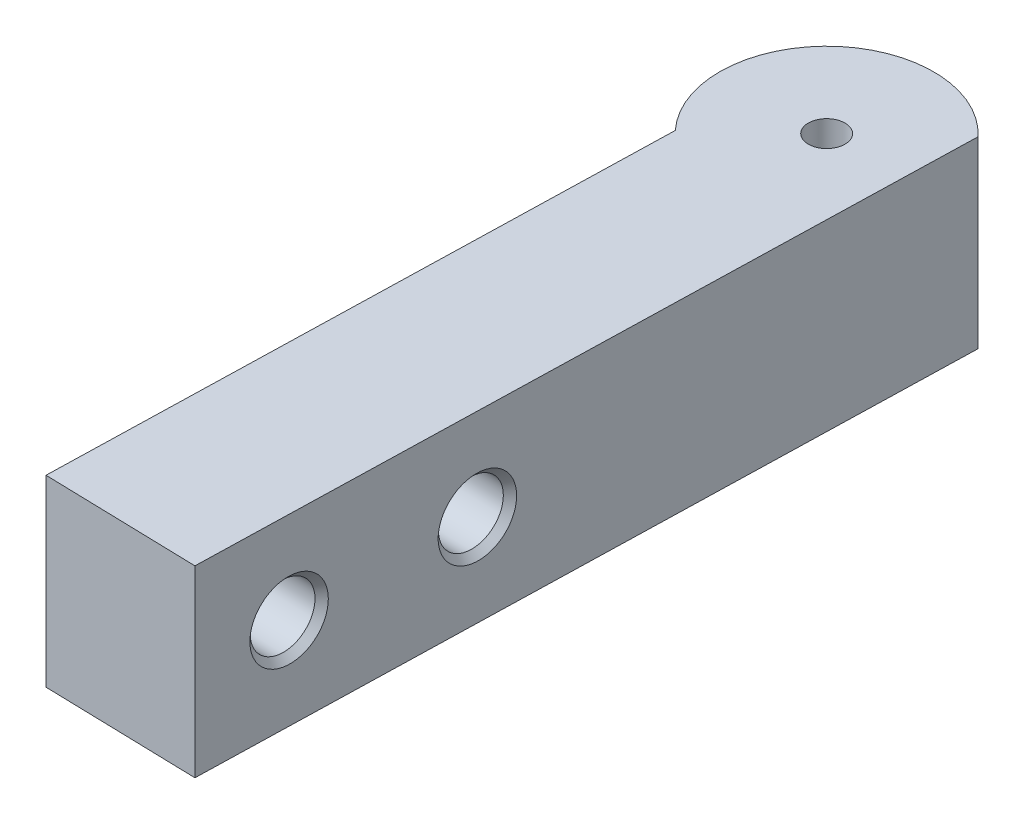
ISO-10303-21;
HEADER;
FILE_DESCRIPTION(('STEP AP214'),'2;1');
FILE_NAME('part.step','',(''),(''),'','','');
FILE_SCHEMA(('AUTOMOTIVE_DESIGN { 1 0 10303 214 1 1 1 1 }'));
ENDSEC;
DATA;
#1=APPLICATION_CONTEXT('core data for automotive mechanical design processes');
#2=APPLICATION_PROTOCOL_DEFINITION('international standard','automotive_design',2000,#1);
#3=PRODUCT_CONTEXT('',#1,'mechanical');
#4=PRODUCT('Part','Part','',(#3));
#5=PRODUCT_RELATED_PRODUCT_CATEGORY('part','',(#4));
#6=PRODUCT_DEFINITION_FORMATION('','',#4);
#7=PRODUCT_DEFINITION_CONTEXT('part definition',#1,'design');
#8=PRODUCT_DEFINITION('design','',#6,#7);
#9=PRODUCT_DEFINITION_SHAPE('','',#8);
#10=(LENGTH_UNIT() NAMED_UNIT(*) SI_UNIT(.MILLI.,.METRE.));
#11=(NAMED_UNIT(*) PLANE_ANGLE_UNIT() SI_UNIT($,.RADIAN.));
#12=(NAMED_UNIT(*) SI_UNIT($,.STERADIAN.) SOLID_ANGLE_UNIT());
#13=UNCERTAINTY_MEASURE_WITH_UNIT(LENGTH_MEASURE(1.E-05),#10,'distance_accuracy_value','');
#14=(GEOMETRIC_REPRESENTATION_CONTEXT(3) GLOBAL_UNCERTAINTY_ASSIGNED_CONTEXT((#13)) GLOBAL_UNIT_ASSIGNED_CONTEXT((#10,
#11,#12)) REPRESENTATION_CONTEXT('',''));
#15=CARTESIAN_POINT('',(0.,0.,0.));
#16=DIRECTION('',(0.,0.,1.));
#17=DIRECTION('',(1.,0.,0.));
#18=AXIS2_PLACEMENT_3D('',#15,#16,#17);
#19=CARTESIAN_POINT('',(16.7949357709333,0.,112.859863032804));
#20=DIRECTION('',(-0.999657324975557,0.,-0.0261769483078728));
#21=DIRECTION('',(-0.0261769483078728,0.,0.999657324975557));
#22=AXIS2_PLACEMENT_3D('',#19,#20,#21);
#23=CONICAL_SURFACE('',#22,2.49999999990428,0.785398163408088);
#24=CARTESIAN_POINT('',(16.7949357708988,0.,112.859863032803));
#25=DIRECTION('',(-0.999657324975557,0.,-0.0261769483078728));
#26=DIRECTION('',(-0.0261769483078728,0.,0.999657324975557));
#27=AXIS2_PLACEMENT_3D('',#24,#25,#26);
#28=CIRCLE('',#27,2.4999999999388);
#29=CARTESIAN_POINT('',(16.7294934001307,0.,115.359006345181));
#30=VERTEX_POINT('',#29);
#31=EDGE_CURVE('E19',#30,#30,#28,.F.);
#32=ORIENTED_EDGE('',*,*,#31,.F.);
#33=EDGE_LOOP('',(#32));
#34=FACE_BOUND('',#33,.T.);
#35=CARTESIAN_POINT('',(17.2297867071741,0.,112.871250005315));
#36=DIRECTION('',(-0.999657324975557,0.,-0.0261769483078733));
#37=DIRECTION('',(-0.0261769483078733,0.,0.999657324975557));
#38=AXIS2_PLACEMENT_3D('',#35,#36,#37);
#39=CIRCLE('',#38,2.06499999999999);
#40=CARTESIAN_POINT('',(17.1757313089183,0.,114.935542381389));
#41=VERTEX_POINT('',#40);
#42=EDGE_CURVE('E109',#41,#41,#39,.F.);
#43=ORIENTED_EDGE('',*,*,#42,.T.);
#44=EDGE_LOOP('',(#43));
#45=FACE_BOUND('',#44,.T.);
#46=ADVANCED_FACE('F16',(#34,#45),#23,.F.);
#47=CARTESIAN_POINT('',(16.4808123912073,0.,124.855750932509));
#48=DIRECTION('',(-0.999657324975557,0.,-0.0261769483078742));
#49=DIRECTION('',(-0.0261769483078742,0.,0.999657324975557));
#50=AXIS2_PLACEMENT_3D('',#47,#48,#49);
#51=CONICAL_SURFACE('',#50,2.49999999999367,0.785398163397826);
#52=CARTESIAN_POINT('',(16.4808123912038,0.,124.855750932509));
#53=DIRECTION('',(-0.999657324975557,0.,-0.0261769483078742));
#54=DIRECTION('',(-0.0261769483078742,0.,0.999657324975557));
#55=AXIS2_PLACEMENT_3D('',#52,#53,#54);
#56=CIRCLE('',#55,2.49999999999712);
#57=CARTESIAN_POINT('',(16.4153700204342,0.,127.354894244945));
#58=VERTEX_POINT('',#57);
#59=EDGE_CURVE('E111',#58,#58,#56,.F.);
#60=ORIENTED_EDGE('',*,*,#59,.F.);
#61=EDGE_LOOP('',(#60));
#62=FACE_BOUND('',#61,.T.);
#63=CARTESIAN_POINT('',(16.9156633274796,0.,124.867137905022));
#64=DIRECTION('',(-0.999657324975557,0.,-0.0261769483078744));
#65=DIRECTION('',(-0.0261769483078744,0.,0.999657324975557));
#66=AXIS2_PLACEMENT_3D('',#63,#64,#65);
#67=CIRCLE('',#66,2.06499999999999);
#68=CARTESIAN_POINT('',(16.8616079292238,0.,126.931430281096));
#69=VERTEX_POINT('',#68);
#70=EDGE_CURVE('E91',#69,#69,#67,.F.);
#71=ORIENTED_EDGE('',*,*,#70,.T.);
#72=EDGE_LOOP('',(#71));
#73=FACE_BOUND('',#72,.T.);
#74=ADVANCED_FACE('F131',(#62,#73),#51,.F.);
#75=CARTESIAN_POINT('',(22.5,8.,86.));
#76=DIRECTION('',(0.,-1.,0.));
#77=DIRECTION('',(0.,0.,-1.));
#78=AXIS2_PLACEMENT_3D('',#75,#76,#77);
#79=CYLINDRICAL_SURFACE('',#78,1.2);
#80=CARTESIAN_POINT('',(22.5,-6.,86.));
#81=DIRECTION('',(0.,-1.,0.));
#82=DIRECTION('',(0.,0.,-1.));
#83=AXIS2_PLACEMENT_3D('',#80,#81,#82);
#84=CIRCLE('',#83,1.2);
#85=CARTESIAN_POINT('',(22.5,-6.,84.8));
#86=VERTEX_POINT('',#85);
#87=EDGE_CURVE('E65',#86,#86,#84,.T.);
#88=ORIENTED_EDGE('',*,*,#87,.T.);
#89=EDGE_LOOP('',(#88));
#90=FACE_BOUND('',#89,.T.);
#91=CARTESIAN_POINT('',(22.5,6.,86.));
#92=DIRECTION('',(0.,-1.,0.));
#93=DIRECTION('',(0.,0.,-1.));
#94=AXIS2_PLACEMENT_3D('',#91,#92,#93);
#95=CIRCLE('',#94,1.2);
#96=CARTESIAN_POINT('',(22.5,6.,84.8));
#97=VERTEX_POINT('',#96);
#98=EDGE_CURVE('E96',#97,#97,#95,.T.);
#99=ORIENTED_EDGE('',*,*,#98,.F.);
#100=EDGE_LOOP('',(#99));
#101=FACE_BOUND('',#100,.T.);
#102=ADVANCED_FACE('F176',(#90,#101),#79,.F.);
#103=CARTESIAN_POINT('',(17.3734730423672,6.,90.766415986112));
#104=DIRECTION('',(-0.999657324975557,0.,-0.026176948307873));
#105=DIRECTION('',(-0.026176948307873,0.,0.999657324975557));
#106=AXIS2_PLACEMENT_3D('',#103,#104,#105);
#107=PLANE('',#106);
#108=ORIENTED_EDGE('',*,*,#59,.T.);
#109=EDGE_LOOP('',(#108));
#110=FACE_BOUND('',#109,.T.);
#111=ORIENTED_EDGE('',*,*,#31,.T.);
#112=EDGE_LOOP('',(#111));
#113=FACE_BOUND('',#112,.T.);
#114=DIRECTION('',(-0.0261769483078731,0.,0.999657324975557));
#115=VECTOR('',#114,1.);
#116=CARTESIAN_POINT('',(17.3734730423672,6.,90.766415986112));
#117=LINE('',#116,#115);
#118=CARTESIAN_POINT('',(17.3734730423672,6.,90.766415986112));
#119=VERTEX_POINT('',#118);
#120=CARTESIAN_POINT('',(16.3237507012679,6.,130.853694882361));
#121=VERTEX_POINT('',#120);
#122=EDGE_CURVE('E117',#119,#121,#117,.T.);
#123=ORIENTED_EDGE('',*,*,#122,.F.);
#124=DIRECTION('',(0.,-1.,0.));
#125=VECTOR('',#124,1.);
#126=CARTESIAN_POINT('',(17.3734730423672,6.,90.766415986112));
#127=LINE('',#126,#125);
#128=CARTESIAN_POINT('',(17.3734730423672,-6.,90.766415986112));
#129=VERTEX_POINT('',#128);
#130=EDGE_CURVE('E64',#129,#119,#127,.F.);
#131=ORIENTED_EDGE('',*,*,#130,.F.);
#132=DIRECTION('',(-0.0261769483078731,0.,0.999657324975557));
#133=VECTOR('',#132,1.);
#134=CARTESIAN_POINT('',(17.3734730423672,-6.,90.766415986112));
#135=LINE('',#134,#133);
#136=CARTESIAN_POINT('',(16.3237507012679,-6.,130.853694882361));
#137=VERTEX_POINT('',#136);
#138=EDGE_CURVE('E61',#129,#137,#135,.T.);
#139=ORIENTED_EDGE('',*,*,#138,.T.);
#140=DIRECTION('',(0.,1.,0.));
#141=VECTOR('',#140,1.);
#142=CARTESIAN_POINT('',(16.3237507012679,6.,130.853694882361));
#143=LINE('',#142,#141);
#144=EDGE_CURVE('E101',#121,#137,#143,.F.);
#145=ORIENTED_EDGE('',*,*,#144,.F.);
#146=EDGE_LOOP('',(#123,#131,#139,#145));
#147=FACE_BOUND('',#146,.T.);
#148=ADVANCED_FACE('F126',(#110,#113,#147),#107,.T.);
#149=CARTESIAN_POINT('',(21.7932223956874,0.,112.99074777434));
#150=DIRECTION('',(-0.999657324975557,0.,-0.0261769483078733));
#151=DIRECTION('',(-0.0261769483078733,0.,0.999657324975557));
#152=AXIS2_PLACEMENT_3D('',#149,#150,#151);
#153=CYLINDRICAL_SURFACE('',#152,2.06499999999999);
#154=ORIENTED_EDGE('',*,*,#42,.F.);
#155=EDGE_LOOP('',(#154));
#156=FACE_BOUND('',#155,.T.);
#157=CARTESIAN_POINT('',(26.3566580842488,0.,113.110245543366));
#158=DIRECTION('',(0.999657324975557,0.,0.0261769483078733));
#159=DIRECTION('',(0.0261769483078733,0.,-0.999657324975557));
#160=AXIS2_PLACEMENT_3D('',#157,#158,#159);
#161=CIRCLE('',#160,2.06500000002866);
#162=CARTESIAN_POINT('',(26.4107134825053,0.,111.045953167263));
#163=VERTEX_POINT('',#162);
#164=EDGE_CURVE('E82',#163,#163,#161,.T.);
#165=ORIENTED_EDGE('',*,*,#164,.T.);
#166=EDGE_LOOP('',(#165));
#167=FACE_BOUND('',#166,.T.);
#168=ADVANCED_FACE('F134',(#156,#167),#153,.F.);
#169=CARTESIAN_POINT('',(21.479099015993,0.,124.986635674047));
#170=DIRECTION('',(-0.999657324975557,0.,-0.0261769483078744));
#171=DIRECTION('',(-0.0261769483078744,0.,0.999657324975557));
#172=AXIS2_PLACEMENT_3D('',#169,#170,#171);
#173=CYLINDRICAL_SURFACE('',#172,2.06499999999999);
#174=ORIENTED_EDGE('',*,*,#70,.F.);
#175=EDGE_LOOP('',(#174));
#176=FACE_BOUND('',#175,.T.);
#177=CARTESIAN_POINT('',(26.0425347045243,0.,125.106133443073));
#178=DIRECTION('',(0.999657324975557,0.,0.0261769483078744));
#179=DIRECTION('',(0.0261769483078745,0.,-0.999657324975557));
#180=AXIS2_PLACEMENT_3D('',#177,#178,#179);
#181=CIRCLE('',#180,2.06500000006222);
#182=CARTESIAN_POINT('',(26.0965901027816,0.,123.041841066936));
#183=VERTEX_POINT('',#182);
#184=EDGE_CURVE('E79',#183,#183,#181,.T.);
#185=ORIENTED_EDGE('',*,*,#184,.T.);
#186=EDGE_LOOP('',(#185));
#187=FACE_BOUND('',#186,.T.);
#188=ADVANCED_FACE('F137',(#176,#187),#173,.F.);
#189=CARTESIAN_POINT('',(0.,-6.,0.));
#190=DIRECTION('',(0.,1.,0.));
#191=DIRECTION('',(0.,0.,1.));
#192=AXIS2_PLACEMENT_3D('',#189,#190,#191);
#193=PLANE('',#192);
#194=ORIENTED_EDGE('',*,*,#87,.F.);
#195=EDGE_LOOP('',(#194));
#196=FACE_BOUND('',#195,.T.);
#197=CARTESIAN_POINT('',(22.5,-6.,86.));
#198=DIRECTION('',(0.,-1.,0.));
#199=DIRECTION('',(0.,0.,-1.));
#200=AXIS2_PLACEMENT_3D('',#197,#198,#199);
#201=CIRCLE('',#200,7.);
#202=CARTESIAN_POINT('',(27.6265269576328,-6.,81.233584013888));
#203=VERTEX_POINT('',#202);
#204=EDGE_CURVE('E54',#203,#129,#201,.F.);
#205=ORIENTED_EDGE('',*,*,#204,.F.);
#206=DIRECTION('',(0.0261769483078732,0.,-0.999657324975557));
#207=VECTOR('',#206,1.);
#208=CARTESIAN_POINT('',(26.3203239510235,-6.00000000000001,131.115464365439));
#209=LINE('',#208,#207);
#210=CARTESIAN_POINT('',(26.3203239510235,-6.00000000000001,131.115464365439));
#211=VERTEX_POINT('',#210);
#212=EDGE_CURVE('E59',#211,#203,#209,.T.);
#213=ORIENTED_EDGE('',*,*,#212,.F.);
#214=DIRECTION('',(0.999657324975557,0.,0.0261769483078695));
#215=VECTOR('',#214,1.);
#216=CARTESIAN_POINT('',(16.3237507012679,-6.,130.853694882361));
#217=LINE('',#216,#215);
#218=EDGE_CURVE('E94',#137,#211,#217,.T.);
#219=ORIENTED_EDGE('',*,*,#218,.F.);
#220=ORIENTED_EDGE('',*,*,#138,.F.);
#221=EDGE_LOOP('',(#205,#213,#219,#220));
#222=FACE_BOUND('',#221,.T.);
#223=ADVANCED_FACE('F56',(#196,#222),#193,.F.);
#224=CARTESIAN_POINT('',(22.5,6.,86.));
#225=DIRECTION('',(0.,-1.,0.));
#226=DIRECTION('',(0.,0.,-1.));
#227=AXIS2_PLACEMENT_3D('',#224,#225,#226);
#228=CYLINDRICAL_SURFACE('',#227,7.);
#229=CARTESIAN_POINT('',(22.5,6.,86.));
#230=DIRECTION('',(0.,-1.,0.));
#231=DIRECTION('',(0.,0.,-1.));
#232=AXIS2_PLACEMENT_3D('',#229,#230,#231);
#233=CIRCLE('',#232,7.);
#234=CARTESIAN_POINT('',(27.6265269576328,6.,81.233584013888));
#235=VERTEX_POINT('',#234);
#236=EDGE_CURVE('E71',#235,#119,#233,.F.);
#237=ORIENTED_EDGE('',*,*,#236,.F.);
#238=DIRECTION('',(0.,1.,0.));
#239=VECTOR('',#238,1.);
#240=CARTESIAN_POINT('',(27.6265269576328,6.,81.233584013888));
#241=LINE('',#240,#239);
#242=EDGE_CURVE('E68',#203,#235,#241,.T.);
#243=ORIENTED_EDGE('',*,*,#242,.F.);
#244=ORIENTED_EDGE('',*,*,#204,.T.);
#245=ORIENTED_EDGE('',*,*,#130,.T.);
#246=EDGE_LOOP('',(#237,#243,#244,#245));
#247=FACE_BOUND('',#246,.T.);
#248=ADVANCED_FACE('F69',(#247),#228,.T.);
#249=CARTESIAN_POINT('',(0.,6.,0.));
#250=DIRECTION('',(0.,1.,0.));
#251=DIRECTION('',(0.,0.,1.));
#252=AXIS2_PLACEMENT_3D('',#249,#250,#251);
#253=PLANE('',#252);
#254=ORIENTED_EDGE('',*,*,#98,.T.);
#255=EDGE_LOOP('',(#254));
#256=FACE_BOUND('',#255,.T.);
#257=DIRECTION('',(0.999657324975557,0.,0.0261769483078695));
#258=VECTOR('',#257,1.);
#259=CARTESIAN_POINT('',(16.3237507012679,6.,130.853694882361));
#260=LINE('',#259,#258);
#261=CARTESIAN_POINT('',(26.3203239510235,6.,131.115464365439));
#262=VERTEX_POINT('',#261);
#263=EDGE_CURVE('E34',#262,#121,#260,.F.);
#264=ORIENTED_EDGE('',*,*,#263,.F.);
#265=DIRECTION('',(0.0261769483078732,0.,-0.999657324975557));
#266=VECTOR('',#265,1.);
#267=CARTESIAN_POINT('',(26.3203239510235,6.,131.115464365439));
#268=LINE('',#267,#266);
#269=EDGE_CURVE('E74',#235,#262,#268,.F.);
#270=ORIENTED_EDGE('',*,*,#269,.F.);
#271=ORIENTED_EDGE('',*,*,#236,.T.);
#272=ORIENTED_EDGE('',*,*,#122,.T.);
#273=EDGE_LOOP('',(#264,#270,#271,#272));
#274=FACE_BOUND('',#273,.T.);
#275=ADVANCED_FACE('F161',(#256,#274),#253,.T.);
#276=CARTESIAN_POINT('',(16.3237507012679,6.,130.853694882361));
#277=DIRECTION('',(-0.0261769483078695,0.,0.999657324975557));
#278=DIRECTION('',(0.999657324975557,0.,0.0261769483078695));
#279=AXIS2_PLACEMENT_3D('',#276,#277,#278);
#280=PLANE('',#279);
#281=ORIENTED_EDGE('',*,*,#263,.T.);
#282=ORIENTED_EDGE('',*,*,#144,.T.);
#283=ORIENTED_EDGE('',*,*,#218,.T.);
#284=DIRECTION('',(0.,1.,0.));
#285=VECTOR('',#284,1.);
#286=CARTESIAN_POINT('',(26.3203239510235,6.,131.115464365439));
#287=LINE('',#286,#285);
#288=EDGE_CURVE('E78',#262,#211,#287,.F.);
#289=ORIENTED_EDGE('',*,*,#288,.F.);
#290=EDGE_LOOP('',(#281,#282,#283,#289));
#291=FACE_BOUND('',#290,.T.);
#292=ADVANCED_FACE('F145',(#291),#280,.T.);
#293=CARTESIAN_POINT('',(26.7915090204427,0.,113.121632515876));
#294=DIRECTION('',(0.999657324975557,0.,0.0261769483078738));
#295=DIRECTION('',(0.0261769483078738,0.,-0.999657324975557));
#296=AXIS2_PLACEMENT_3D('',#293,#294,#295);
#297=CONICAL_SURFACE('',#296,2.49999999990121,0.785398163386806);
#298=ORIENTED_EDGE('',*,*,#164,.F.);
#299=EDGE_LOOP('',(#298));
#300=FACE_BOUND('',#299,.T.);
#301=CARTESIAN_POINT('',(26.7915090205415,0.,113.121632515878));
#302=DIRECTION('',(0.999657324975557,0.,0.0261769483078738));
#303=DIRECTION('',(0.0261769483078738,0.,-0.999657324975557));
#304=AXIS2_PLACEMENT_3D('',#301,#302,#303);
#305=CIRCLE('',#304,2.50000000000006);
#306=CARTESIAN_POINT('',(26.8569513913112,0.,110.622489203439));
#307=VERTEX_POINT('',#306);
#308=EDGE_CURVE('E25',#307,#307,#305,.F.);
#309=ORIENTED_EDGE('',*,*,#308,.F.);
#310=EDGE_LOOP('',(#309));
#311=FACE_BOUND('',#310,.T.);
#312=ADVANCED_FACE('F141',(#300,#311),#297,.F.);
#313=CARTESIAN_POINT('',(26.4773856408303,0.,125.117520415585));
#314=DIRECTION('',(0.999657324975557,0.,0.026176948307873));
#315=DIRECTION('',(0.026176948307873,0.,-0.999657324975557));
#316=AXIS2_PLACEMENT_3D('',#313,#314,#315);
#317=CONICAL_SURFACE('',#316,2.49999999999458,0.785398163457239);
#318=ORIENTED_EDGE('',*,*,#184,.F.);
#319=EDGE_LOOP('',(#318));
#320=FACE_BOUND('',#319,.T.);
#321=CARTESIAN_POINT('',(26.477385640776,0.,125.117520415584));
#322=DIRECTION('',(0.999657324975557,0.,0.026176948307873));
#323=DIRECTION('',(0.026176948307873,0.,-0.999657324975557));
#324=AXIS2_PLACEMENT_3D('',#321,#322,#323);
#325=CIRCLE('',#324,2.49999999994029);
#326=CARTESIAN_POINT('',(26.5428280115441,0.,122.618377103204));
#327=VERTEX_POINT('',#326);
#328=EDGE_CURVE('E10',#327,#327,#325,.F.);
#329=ORIENTED_EDGE('',*,*,#328,.F.);
#330=EDGE_LOOP('',(#329));
#331=FACE_BOUND('',#330,.T.);
#332=ADVANCED_FACE('F144',(#320,#331),#317,.F.);
#333=CARTESIAN_POINT('',(26.3203239510235,6.,131.115464365439));
#334=DIRECTION('',(0.999657324975557,0.,0.0261769483078732));
#335=DIRECTION('',(0.0261769483078732,0.,-0.999657324975557));
#336=AXIS2_PLACEMENT_3D('',#333,#334,#335);
#337=PLANE('',#336);
#338=ORIENTED_EDGE('',*,*,#328,.T.);
#339=EDGE_LOOP('',(#338));
#340=FACE_BOUND('',#339,.T.);
#341=ORIENTED_EDGE('',*,*,#308,.T.);
#342=EDGE_LOOP('',(#341));
#343=FACE_BOUND('',#342,.T.);
#344=ORIENTED_EDGE('',*,*,#269,.T.);
#345=ORIENTED_EDGE('',*,*,#288,.T.);
#346=ORIENTED_EDGE('',*,*,#212,.T.);
#347=ORIENTED_EDGE('',*,*,#242,.T.);
#348=EDGE_LOOP('',(#344,#345,#346,#347));
#349=FACE_BOUND('',#348,.T.);
#350=ADVANCED_FACE('F77',(#340,#343,#349),#337,.T.);
#351=CLOSED_SHELL('',(#46,#74,#102,#148,#168,#188,#223,#248,#275,#292,#312,#332,#350));
#352=MANIFOLD_SOLID_BREP('B1',#351);
#353=ADVANCED_BREP_SHAPE_REPRESENTATION('',(#18,#352),#14);
#354=SHAPE_DEFINITION_REPRESENTATION(#9,#353);
ENDSEC;
END-ISO-10303-21;
